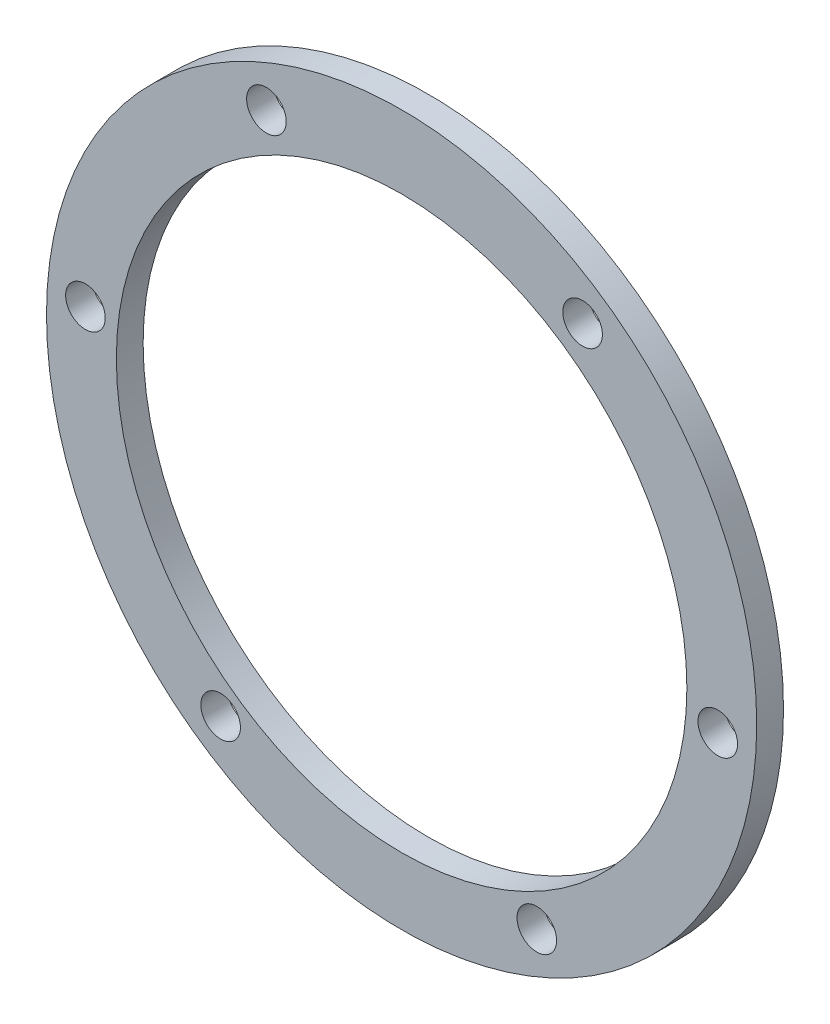
ISO-10303-21;
HEADER;
FILE_DESCRIPTION(('STEP AP214'),'2;1');
FILE_NAME('part.step','',(''),(''),'','','');
FILE_SCHEMA(('AUTOMOTIVE_DESIGN { 1 0 10303 214 1 1 1 1 }'));
ENDSEC;
DATA;
#1=APPLICATION_CONTEXT('core data for automotive mechanical design processes');
#2=APPLICATION_PROTOCOL_DEFINITION('international standard','automotive_design',2000,#1);
#3=PRODUCT_CONTEXT('',#1,'mechanical');
#4=PRODUCT('Part','Part','',(#3));
#5=PRODUCT_RELATED_PRODUCT_CATEGORY('part','',(#4));
#6=PRODUCT_DEFINITION_FORMATION('','',#4);
#7=PRODUCT_DEFINITION_CONTEXT('part definition',#1,'design');
#8=PRODUCT_DEFINITION('design','',#6,#7);
#9=PRODUCT_DEFINITION_SHAPE('','',#8);
#10=(LENGTH_UNIT() NAMED_UNIT(*) SI_UNIT(.MILLI.,.METRE.));
#11=(NAMED_UNIT(*) PLANE_ANGLE_UNIT() SI_UNIT($,.RADIAN.));
#12=(NAMED_UNIT(*) SI_UNIT($,.STERADIAN.) SOLID_ANGLE_UNIT());
#13=UNCERTAINTY_MEASURE_WITH_UNIT(LENGTH_MEASURE(1.E-05),#10,'distance_accuracy_value','');
#14=(GEOMETRIC_REPRESENTATION_CONTEXT(3) GLOBAL_UNCERTAINTY_ASSIGNED_CONTEXT((#13)) GLOBAL_UNIT_ASSIGNED_CONTEXT((#10,
#11,#12)) REPRESENTATION_CONTEXT('',''));
#15=CARTESIAN_POINT('',(0.,0.,0.));
#16=DIRECTION('',(0.,0.,1.));
#17=DIRECTION('',(1.,0.,0.));
#18=AXIS2_PLACEMENT_3D('',#15,#16,#17);
#19=CARTESIAN_POINT('',(0.,-0.260069896866555,2.3));
#20=DIRECTION('',(0.,0.,-1.));
#21=DIRECTION('',(-1.,0.,0.));
#22=AXIS2_PLACEMENT_3D('',#19,#20,#21);
#23=CYLINDRICAL_SURFACE('',#22,30.5);
#24=CARTESIAN_POINT('',(0.,-0.260069896866555,2.3));
#25=DIRECTION('',(0.,0.,1.));
#26=DIRECTION('',(1.,0.,0.));
#27=AXIS2_PLACEMENT_3D('',#24,#25,#26);
#28=CIRCLE('',#27,30.5);
#29=CARTESIAN_POINT('',(30.5,-0.260069896866555,2.3));
#30=VERTEX_POINT('',#29);
#31=EDGE_CURVE('E41',#30,#30,#28,.T.);
#32=ORIENTED_EDGE('',*,*,#31,.F.);
#33=EDGE_LOOP('',(#32));
#34=FACE_BOUND('',#33,.T.);
#35=CARTESIAN_POINT('',(0.,-0.260069896866555,0.));
#36=DIRECTION('',(0.,0.,1.));
#37=DIRECTION('',(1.,0.,0.));
#38=AXIS2_PLACEMENT_3D('',#35,#36,#37);
#39=CIRCLE('',#38,30.5);
#40=CARTESIAN_POINT('',(30.5,-0.260069896866555,0.));
#41=VERTEX_POINT('',#40);
#42=EDGE_CURVE('E48',#41,#41,#39,.T.);
#43=ORIENTED_EDGE('',*,*,#42,.T.);
#44=EDGE_LOOP('',(#43));
#45=FACE_BOUND('',#44,.T.);
#46=ADVANCED_FACE('F34',(#34,#45),#23,.T.);
#47=CARTESIAN_POINT('',(0.,-0.525514899238977,2.3));
#48=DIRECTION('',(0.,0.,-1.));
#49=DIRECTION('',(-1.,0.,0.));
#50=AXIS2_PLACEMENT_3D('',#47,#48,#49);
#51=CYLINDRICAL_SURFACE('',#50,24.5);
#52=CARTESIAN_POINT('',(0.,-0.525514899238977,2.3));
#53=DIRECTION('',(0.,0.,1.));
#54=DIRECTION('',(1.,0.,0.));
#55=AXIS2_PLACEMENT_3D('',#52,#53,#54);
#56=CIRCLE('',#55,24.5);
#57=CARTESIAN_POINT('',(24.5,-0.525514899238977,2.3));
#58=VERTEX_POINT('',#57);
#59=EDGE_CURVE('E10',#58,#58,#56,.T.);
#60=ORIENTED_EDGE('',*,*,#59,.T.);
#61=EDGE_LOOP('',(#60));
#62=FACE_BOUND('',#61,.T.);
#63=CARTESIAN_POINT('',(0.,-0.525514899238977,0.));
#64=DIRECTION('',(0.,0.,1.));
#65=DIRECTION('',(1.,0.,0.));
#66=AXIS2_PLACEMENT_3D('',#63,#64,#65);
#67=CIRCLE('',#66,24.5);
#68=CARTESIAN_POINT('',(24.5,-0.525514899238977,0.));
#69=VERTEX_POINT('',#68);
#70=EDGE_CURVE('E37',#69,#69,#67,.T.);
#71=ORIENTED_EDGE('',*,*,#70,.F.);
#72=EDGE_LOOP('',(#71));
#73=FACE_BOUND('',#72,.T.);
#74=ADVANCED_FACE('F107',(#62,#73),#51,.F.);
#75=CARTESIAN_POINT('',(0.,0.,2.3));
#76=DIRECTION('',(0.,0.,1.));
#77=DIRECTION('',(1.,0.,0.));
#78=AXIS2_PLACEMENT_3D('',#75,#76,#77);
#79=PLANE('',#78);
#80=CARTESIAN_POINT('',(27.155311089893,-2.52977904368061,2.3));
#81=DIRECTION('',(0.,0.,1.));
#82=DIRECTION('',(1.,0.,0.));
#83=AXIS2_PLACEMENT_3D('',#80,#81,#82);
#84=CIRCLE('',#83,1.69999999999998);
#85=CARTESIAN_POINT('',(28.855311089893,-2.52977904368061,2.3));
#86=VERTEX_POINT('',#85);
#87=EDGE_CURVE('E59',#86,#86,#84,.T.);
#88=ORIENTED_EDGE('',*,*,#87,.F.);
#89=EDGE_LOOP('',(#88));
#90=FACE_BOUND('',#89,.T.);
#91=CARTESIAN_POINT('',(11.6120297646036,-24.9121137217903,2.3));
#92=DIRECTION('',(0.,0.,1.));
#93=DIRECTION('',(1.,0.,0.));
#94=AXIS2_PLACEMENT_3D('',#91,#92,#93);
#95=CIRCLE('',#94,1.69999999999998);
#96=CARTESIAN_POINT('',(13.3120297646036,-24.9121137217903,2.3));
#97=VERTEX_POINT('',#96);
#98=EDGE_CURVE('E81',#97,#97,#95,.T.);
#99=ORIENTED_EDGE('',*,*,#98,.F.);
#100=EDGE_LOOP('',(#99));
#101=FACE_BOUND('',#100,.T.);
#102=CARTESIAN_POINT('',(-15.5432813252893,-22.6424045749762,2.3));
#103=DIRECTION('',(0.,0.,1.));
#104=DIRECTION('',(1.,0.,0.));
#105=AXIS2_PLACEMENT_3D('',#102,#103,#104);
#106=CIRCLE('',#105,1.69999999999998);
#107=CARTESIAN_POINT('',(-13.8432813252894,-22.6424045749762,2.3));
#108=VERTEX_POINT('',#107);
#109=EDGE_CURVE('E75',#108,#108,#106,.T.);
#110=ORIENTED_EDGE('',*,*,#109,.F.);
#111=EDGE_LOOP('',(#110));
#112=FACE_BOUND('',#111,.T.);
#113=CARTESIAN_POINT('',(-27.155311089893,2.00963924994769,2.3));
#114=DIRECTION('',(0.,0.,1.));
#115=DIRECTION('',(1.,0.,0.));
#116=AXIS2_PLACEMENT_3D('',#113,#114,#115);
#117=CIRCLE('',#116,1.69999999999998);
#118=CARTESIAN_POINT('',(-25.455311089893,2.00963924994769,2.3));
#119=VERTEX_POINT('',#118);
#120=EDGE_CURVE('E69',#119,#119,#117,.T.);
#121=ORIENTED_EDGE('',*,*,#120,.F.);
#122=EDGE_LOOP('',(#121));
#123=FACE_BOUND('',#122,.T.);
#124=CARTESIAN_POINT('',(-11.6120297646034,24.3919739280572,2.3));
#125=DIRECTION('',(0.,0.,1.));
#126=DIRECTION('',(1.,0.,0.));
#127=AXIS2_PLACEMENT_3D('',#124,#125,#126);
#128=CIRCLE('',#127,1.69999999999998);
#129=CARTESIAN_POINT('',(-9.91202976460343,24.3919739280572,2.3));
#130=VERTEX_POINT('',#129);
#131=EDGE_CURVE('E62',#130,#130,#128,.T.);
#132=ORIENTED_EDGE('',*,*,#131,.F.);
#133=EDGE_LOOP('',(#132));
#134=FACE_BOUND('',#133,.T.);
#135=CARTESIAN_POINT('',(15.5432813252893,22.1222647812431,2.3));
#136=DIRECTION('',(0.,0.,1.));
#137=DIRECTION('',(1.,0.,0.));
#138=AXIS2_PLACEMENT_3D('',#135,#136,#137);
#139=CIRCLE('',#138,1.69999999999998);
#140=CARTESIAN_POINT('',(17.2432813252893,22.1222647812431,2.3));
#141=VERTEX_POINT('',#140);
#142=EDGE_CURVE('E50',#141,#141,#139,.T.);
#143=ORIENTED_EDGE('',*,*,#142,.F.);
#144=EDGE_LOOP('',(#143));
#145=FACE_BOUND('',#144,.T.);
#146=ORIENTED_EDGE('',*,*,#31,.T.);
#147=EDGE_LOOP('',(#146));
#148=FACE_BOUND('',#147,.T.);
#149=ORIENTED_EDGE('',*,*,#59,.F.);
#150=EDGE_LOOP('',(#149));
#151=FACE_BOUND('',#150,.T.);
#152=ADVANCED_FACE('F112',(#90,#101,#112,#123,#134,#145,#148,#151),#79,.T.);
#153=CARTESIAN_POINT('',(0.,0.,0.));
#154=DIRECTION('',(0.,0.,1.));
#155=DIRECTION('',(1.,0.,0.));
#156=AXIS2_PLACEMENT_3D('',#153,#154,#155);
#157=PLANE('',#156);
#158=CARTESIAN_POINT('',(27.155311089893,-2.52977904368061,0.));
#159=DIRECTION('',(0.,0.,1.));
#160=DIRECTION('',(0.499999999999998,-0.86602540378444,0.));
#161=AXIS2_PLACEMENT_3D('',#158,#159,#160);
#162=CIRCLE('',#161,1.69999999999998);
#163=CARTESIAN_POINT('',(28.005311089893,-4.00202223011414,0.));
#164=VERTEX_POINT('',#163);
#165=EDGE_CURVE('E84',#164,#164,#162,.T.);
#166=ORIENTED_EDGE('',*,*,#165,.T.);
#167=EDGE_LOOP('',(#166));
#168=FACE_BOUND('',#167,.T.);
#169=CARTESIAN_POINT('',(11.6120297646036,-24.9121137217903,0.));
#170=DIRECTION('',(0.,0.,1.));
#171=DIRECTION('',(-0.500000000000004,-0.866025403784436,0.));
#172=AXIS2_PLACEMENT_3D('',#169,#170,#171);
#173=CIRCLE('',#172,1.69999999999998);
#174=CARTESIAN_POINT('',(10.7620297646036,-26.3843569082238,0.));
#175=VERTEX_POINT('',#174);
#176=EDGE_CURVE('E78',#175,#175,#173,.T.);
#177=ORIENTED_EDGE('',*,*,#176,.T.);
#178=EDGE_LOOP('',(#177));
#179=FACE_BOUND('',#178,.T.);
#180=CARTESIAN_POINT('',(-15.5432813252893,-22.6424045749762,0.));
#181=DIRECTION('',(0.,0.,1.));
#182=DIRECTION('',(-1.,0.,0.));
#183=AXIS2_PLACEMENT_3D('',#180,#181,#182);
#184=CIRCLE('',#183,1.69999999999998);
#185=CARTESIAN_POINT('',(-17.2432813252893,-22.6424045749762,0.));
#186=VERTEX_POINT('',#185);
#187=EDGE_CURVE('E72',#186,#186,#184,.T.);
#188=ORIENTED_EDGE('',*,*,#187,.T.);
#189=EDGE_LOOP('',(#188));
#190=FACE_BOUND('',#189,.T.);
#191=CARTESIAN_POINT('',(-27.155311089893,2.00963924994769,0.));
#192=DIRECTION('',(0.,0.,1.));
#193=DIRECTION('',(-0.499999999999992,0.866025403784443,0.));
#194=AXIS2_PLACEMENT_3D('',#191,#192,#193);
#195=CIRCLE('',#194,1.69999999999998);
#196=CARTESIAN_POINT('',(-28.005311089893,3.48188243638122,0.));
#197=VERTEX_POINT('',#196);
#198=EDGE_CURVE('E65',#197,#197,#195,.T.);
#199=ORIENTED_EDGE('',*,*,#198,.T.);
#200=EDGE_LOOP('',(#199));
#201=FACE_BOUND('',#200,.T.);
#202=CARTESIAN_POINT('',(-11.6120297646034,24.3919739280572,0.));
#203=DIRECTION('',(0.,0.,1.));
#204=DIRECTION('',(0.50000000000001,0.866025403784433,0.));
#205=AXIS2_PLACEMENT_3D('',#202,#203,#204);
#206=CIRCLE('',#205,1.69999999999998);
#207=CARTESIAN_POINT('',(-10.7620297646034,25.8642171144908,0.));
#208=VERTEX_POINT('',#207);
#209=EDGE_CURVE('E66',#208,#208,#206,.T.);
#210=ORIENTED_EDGE('',*,*,#209,.T.);
#211=EDGE_LOOP('',(#210));
#212=FACE_BOUND('',#211,.T.);
#213=CARTESIAN_POINT('',(15.5432813252893,22.1222647812431,0.));
#214=DIRECTION('',(0.,0.,1.));
#215=DIRECTION('',(1.,0.,0.));
#216=AXIS2_PLACEMENT_3D('',#213,#214,#215);
#217=CIRCLE('',#216,1.69999999999998);
#218=CARTESIAN_POINT('',(17.2432813252893,22.1222647812431,0.));
#219=VERTEX_POINT('',#218);
#220=EDGE_CURVE('E55',#219,#219,#217,.T.);
#221=ORIENTED_EDGE('',*,*,#220,.T.);
#222=EDGE_LOOP('',(#221));
#223=FACE_BOUND('',#222,.T.);
#224=ORIENTED_EDGE('',*,*,#42,.F.);
#225=EDGE_LOOP('',(#224));
#226=FACE_BOUND('',#225,.T.);
#227=ORIENTED_EDGE('',*,*,#70,.T.);
#228=EDGE_LOOP('',(#227));
#229=FACE_BOUND('',#228,.T.);
#230=ADVANCED_FACE('F92',(#168,#179,#190,#201,#212,#223,#226,#229),#157,.F.);
#231=CARTESIAN_POINT('',(15.5432813252893,22.1222647812431,2.301));
#232=DIRECTION('',(0.,0.,-1.));
#233=DIRECTION('',(-1.,0.,0.));
#234=AXIS2_PLACEMENT_3D('',#231,#232,#233);
#235=CYLINDRICAL_SURFACE('',#234,1.69999999999998);
#236=ORIENTED_EDGE('',*,*,#142,.T.);
#237=EDGE_LOOP('',(#236));
#238=FACE_BOUND('',#237,.T.);
#239=ORIENTED_EDGE('',*,*,#220,.F.);
#240=EDGE_LOOP('',(#239));
#241=FACE_BOUND('',#240,.T.);
#242=ADVANCED_FACE('F122',(#238,#241),#235,.F.);
#243=CARTESIAN_POINT('',(-11.6120297646034,24.3919739280572,2.301));
#244=DIRECTION('',(0.,0.,-1.));
#245=DIRECTION('',(-1.,0.,0.));
#246=AXIS2_PLACEMENT_3D('',#243,#244,#245);
#247=CYLINDRICAL_SURFACE('',#246,1.69999999999998);
#248=ORIENTED_EDGE('',*,*,#131,.T.);
#249=EDGE_LOOP('',(#248));
#250=FACE_BOUND('',#249,.T.);
#251=ORIENTED_EDGE('',*,*,#209,.F.);
#252=EDGE_LOOP('',(#251));
#253=FACE_BOUND('',#252,.T.);
#254=ADVANCED_FACE('F129',(#250,#253),#247,.F.);
#255=CARTESIAN_POINT('',(-27.155311089893,2.00963924994769,2.301));
#256=DIRECTION('',(0.,0.,-1.));
#257=DIRECTION('',(-1.,0.,0.));
#258=AXIS2_PLACEMENT_3D('',#255,#256,#257);
#259=CYLINDRICAL_SURFACE('',#258,1.69999999999998);
#260=ORIENTED_EDGE('',*,*,#120,.T.);
#261=EDGE_LOOP('',(#260));
#262=FACE_BOUND('',#261,.T.);
#263=ORIENTED_EDGE('',*,*,#198,.F.);
#264=EDGE_LOOP('',(#263));
#265=FACE_BOUND('',#264,.T.);
#266=ADVANCED_FACE('F132',(#262,#265),#259,.F.);
#267=CARTESIAN_POINT('',(-15.5432813252893,-22.6424045749762,2.301));
#268=DIRECTION('',(0.,0.,-1.));
#269=DIRECTION('',(-1.,0.,0.));
#270=AXIS2_PLACEMENT_3D('',#267,#268,#269);
#271=CYLINDRICAL_SURFACE('',#270,1.69999999999998);
#272=ORIENTED_EDGE('',*,*,#109,.T.);
#273=EDGE_LOOP('',(#272));
#274=FACE_BOUND('',#273,.T.);
#275=ORIENTED_EDGE('',*,*,#187,.F.);
#276=EDGE_LOOP('',(#275));
#277=FACE_BOUND('',#276,.T.);
#278=ADVANCED_FACE('F103',(#274,#277),#271,.F.);
#279=CARTESIAN_POINT('',(11.6120297646036,-24.9121137217903,2.301));
#280=DIRECTION('',(0.,0.,-1.));
#281=DIRECTION('',(-1.,0.,0.));
#282=AXIS2_PLACEMENT_3D('',#279,#280,#281);
#283=CYLINDRICAL_SURFACE('',#282,1.69999999999998);
#284=ORIENTED_EDGE('',*,*,#98,.T.);
#285=EDGE_LOOP('',(#284));
#286=FACE_BOUND('',#285,.T.);
#287=ORIENTED_EDGE('',*,*,#176,.F.);
#288=EDGE_LOOP('',(#287));
#289=FACE_BOUND('',#288,.T.);
#290=ADVANCED_FACE('F97',(#286,#289),#283,.F.);
#291=CARTESIAN_POINT('',(27.155311089893,-2.52977904368061,2.301));
#292=DIRECTION('',(0.,0.,-1.));
#293=DIRECTION('',(-1.,0.,0.));
#294=AXIS2_PLACEMENT_3D('',#291,#292,#293);
#295=CYLINDRICAL_SURFACE('',#294,1.69999999999998);
#296=ORIENTED_EDGE('',*,*,#87,.T.);
#297=EDGE_LOOP('',(#296));
#298=FACE_BOUND('',#297,.T.);
#299=ORIENTED_EDGE('',*,*,#165,.F.);
#300=EDGE_LOOP('',(#299));
#301=FACE_BOUND('',#300,.T.);
#302=ADVANCED_FACE('F95',(#298,#301),#295,.F.);
#303=CLOSED_SHELL('',(#46,#74,#152,#230,#242,#254,#266,#278,#290,#302));
#304=MANIFOLD_SOLID_BREP('B2',#303);
#305=ADVANCED_BREP_SHAPE_REPRESENTATION('',(#18,#304),#14);
#306=SHAPE_DEFINITION_REPRESENTATION(#9,#305);
ENDSEC;
END-ISO-10303-21;
